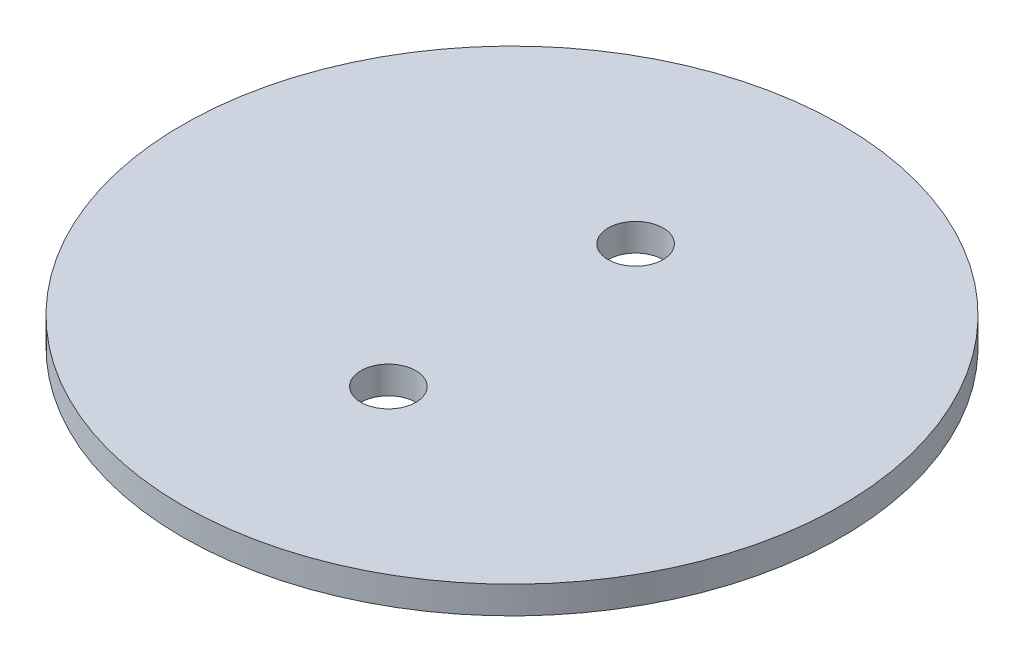
ISO-10303-21;
HEADER;
FILE_DESCRIPTION(('STEP AP214'),'2;1');
FILE_NAME('part.step','',(''),(''),'','','');
FILE_SCHEMA(('AUTOMOTIVE_DESIGN { 1 0 10303 214 1 1 1 1 }'));
ENDSEC;
DATA;
#1=APPLICATION_CONTEXT('core data for automotive mechanical design processes');
#2=APPLICATION_PROTOCOL_DEFINITION('international standard','automotive_design',2000,#1);
#3=PRODUCT_CONTEXT('',#1,'mechanical');
#4=PRODUCT('Part','Part','',(#3));
#5=PRODUCT_RELATED_PRODUCT_CATEGORY('part','',(#4));
#6=PRODUCT_DEFINITION_FORMATION('','',#4);
#7=PRODUCT_DEFINITION_CONTEXT('part definition',#1,'design');
#8=PRODUCT_DEFINITION('design','',#6,#7);
#9=PRODUCT_DEFINITION_SHAPE('','',#8);
#10=(LENGTH_UNIT() NAMED_UNIT(*) SI_UNIT(.MILLI.,.METRE.));
#11=(NAMED_UNIT(*) PLANE_ANGLE_UNIT() SI_UNIT($,.RADIAN.));
#12=(NAMED_UNIT(*) SI_UNIT($,.STERADIAN.) SOLID_ANGLE_UNIT());
#13=UNCERTAINTY_MEASURE_WITH_UNIT(LENGTH_MEASURE(1.E-05),#10,'distance_accuracy_value','');
#14=(GEOMETRIC_REPRESENTATION_CONTEXT(3) GLOBAL_UNCERTAINTY_ASSIGNED_CONTEXT((#13)) GLOBAL_UNIT_ASSIGNED_CONTEXT((#10,
#11,#12)) REPRESENTATION_CONTEXT('',''));
#15=CARTESIAN_POINT('',(0.,0.,0.));
#16=DIRECTION('',(0.,0.,1.));
#17=DIRECTION('',(1.,0.,0.));
#18=AXIS2_PLACEMENT_3D('',#15,#16,#17);
#19=CARTESIAN_POINT('',(0.,-3.,-13.5));
#20=DIRECTION('',(0.,1.,0.));
#21=DIRECTION('',(0.,0.,1.));
#22=AXIS2_PLACEMENT_3D('',#19,#20,#21);
#23=CYLINDRICAL_SURFACE('',#22,3.);
#24=CARTESIAN_POINT('',(0.,-3.,-13.5));
#25=DIRECTION('',(0.,1.,0.));
#26=DIRECTION('',(0.,0.,1.));
#27=AXIS2_PLACEMENT_3D('',#24,#25,#26);
#28=CIRCLE('',#27,3.);
#29=CARTESIAN_POINT('',(0.,-3.,-10.5));
#30=VERTEX_POINT('',#29);
#31=EDGE_CURVE('E42',#30,#30,#28,.T.);
#32=ORIENTED_EDGE('',*,*,#31,.F.);
#33=EDGE_LOOP('',(#32));
#34=FACE_BOUND('',#33,.T.);
#35=CARTESIAN_POINT('',(0.,0.,-13.5));
#36=DIRECTION('',(0.,1.,0.));
#37=DIRECTION('',(0.,0.,1.));
#38=AXIS2_PLACEMENT_3D('',#35,#36,#37);
#39=CIRCLE('',#38,3.);
#40=CARTESIAN_POINT('',(0.,0.,-10.5));
#41=VERTEX_POINT('',#40);
#42=EDGE_CURVE('E53',#41,#41,#39,.T.);
#43=ORIENTED_EDGE('',*,*,#42,.T.);
#44=EDGE_LOOP('',(#43));
#45=FACE_BOUND('',#44,.T.);
#46=ADVANCED_FACE('F34',(#34,#45),#23,.F.);
#47=CARTESIAN_POINT('',(0.,-3.,13.5));
#48=DIRECTION('',(0.,1.,0.));
#49=DIRECTION('',(0.,0.,1.));
#50=AXIS2_PLACEMENT_3D('',#47,#48,#49);
#51=CYLINDRICAL_SURFACE('',#50,3.);
#52=CARTESIAN_POINT('',(0.,-3.,13.5));
#53=DIRECTION('',(0.,1.,0.));
#54=DIRECTION('',(0.,0.,1.));
#55=AXIS2_PLACEMENT_3D('',#52,#53,#54);
#56=CIRCLE('',#55,3.);
#57=CARTESIAN_POINT('',(0.,-3.,16.5));
#58=VERTEX_POINT('',#57);
#59=EDGE_CURVE('E47',#58,#58,#56,.T.);
#60=ORIENTED_EDGE('',*,*,#59,.F.);
#61=EDGE_LOOP('',(#60));
#62=FACE_BOUND('',#61,.T.);
#63=CARTESIAN_POINT('',(0.,0.,13.5));
#64=DIRECTION('',(0.,1.,0.));
#65=DIRECTION('',(0.,0.,1.));
#66=AXIS2_PLACEMENT_3D('',#63,#64,#65);
#67=CIRCLE('',#66,3.);
#68=CARTESIAN_POINT('',(0.,0.,16.5));
#69=VERTEX_POINT('',#68);
#70=EDGE_CURVE('E51',#69,#69,#67,.T.);
#71=ORIENTED_EDGE('',*,*,#70,.T.);
#72=EDGE_LOOP('',(#71));
#73=FACE_BOUND('',#72,.T.);
#74=ADVANCED_FACE('F36',(#62,#73),#51,.F.);
#75=CARTESIAN_POINT('',(0.,-3.,0.));
#76=DIRECTION('',(0.,1.,0.));
#77=DIRECTION('',(0.,0.,1.));
#78=AXIS2_PLACEMENT_3D('',#75,#76,#77);
#79=CYLINDRICAL_SURFACE('',#78,36.);
#80=CARTESIAN_POINT('',(0.,-3.,0.));
#81=DIRECTION('',(0.,1.,0.));
#82=DIRECTION('',(0.,0.,1.));
#83=AXIS2_PLACEMENT_3D('',#80,#81,#82);
#84=CIRCLE('',#83,36.);
#85=CARTESIAN_POINT('',(0.,-3.,36.));
#86=VERTEX_POINT('',#85);
#87=EDGE_CURVE('E10',#86,#86,#84,.T.);
#88=ORIENTED_EDGE('',*,*,#87,.T.);
#89=EDGE_LOOP('',(#88));
#90=FACE_BOUND('',#89,.T.);
#91=CARTESIAN_POINT('',(0.,0.,0.));
#92=DIRECTION('',(0.,1.,0.));
#93=DIRECTION('',(0.,0.,1.));
#94=AXIS2_PLACEMENT_3D('',#91,#92,#93);
#95=CIRCLE('',#94,36.);
#96=CARTESIAN_POINT('',(0.,0.,36.));
#97=VERTEX_POINT('',#96);
#98=EDGE_CURVE('E38',#97,#97,#95,.T.);
#99=ORIENTED_EDGE('',*,*,#98,.F.);
#100=EDGE_LOOP('',(#99));
#101=FACE_BOUND('',#100,.T.);
#102=ADVANCED_FACE('F68',(#90,#101),#79,.T.);
#103=CARTESIAN_POINT('',(0.,-3.,0.));
#104=DIRECTION('',(0.,1.,0.));
#105=DIRECTION('',(0.,0.,1.));
#106=AXIS2_PLACEMENT_3D('',#103,#104,#105);
#107=PLANE('',#106);
#108=ORIENTED_EDGE('',*,*,#59,.T.);
#109=EDGE_LOOP('',(#108));
#110=FACE_BOUND('',#109,.T.);
#111=ORIENTED_EDGE('',*,*,#31,.T.);
#112=EDGE_LOOP('',(#111));
#113=FACE_BOUND('',#112,.T.);
#114=ORIENTED_EDGE('',*,*,#87,.F.);
#115=EDGE_LOOP('',(#114));
#116=FACE_BOUND('',#115,.T.);
#117=ADVANCED_FACE('F63',(#110,#113,#116),#107,.F.);
#118=CARTESIAN_POINT('',(0.,0.,0.));
#119=DIRECTION('',(0.,1.,0.));
#120=DIRECTION('',(0.,0.,1.));
#121=AXIS2_PLACEMENT_3D('',#118,#119,#120);
#122=PLANE('',#121);
#123=ORIENTED_EDGE('',*,*,#70,.F.);
#124=EDGE_LOOP('',(#123));
#125=FACE_BOUND('',#124,.T.);
#126=ORIENTED_EDGE('',*,*,#42,.F.);
#127=EDGE_LOOP('',(#126));
#128=FACE_BOUND('',#127,.T.);
#129=ORIENTED_EDGE('',*,*,#98,.T.);
#130=EDGE_LOOP('',(#129));
#131=FACE_BOUND('',#130,.T.);
#132=ADVANCED_FACE('F71',(#125,#128,#131),#122,.T.);
#133=CLOSED_SHELL('',(#46,#74,#102,#117,#132));
#134=MANIFOLD_SOLID_BREP('B2',#133);
#135=ADVANCED_BREP_SHAPE_REPRESENTATION('',(#18,#134),#14);
#136=SHAPE_DEFINITION_REPRESENTATION(#9,#135);
ENDSEC;
END-ISO-10303-21;
